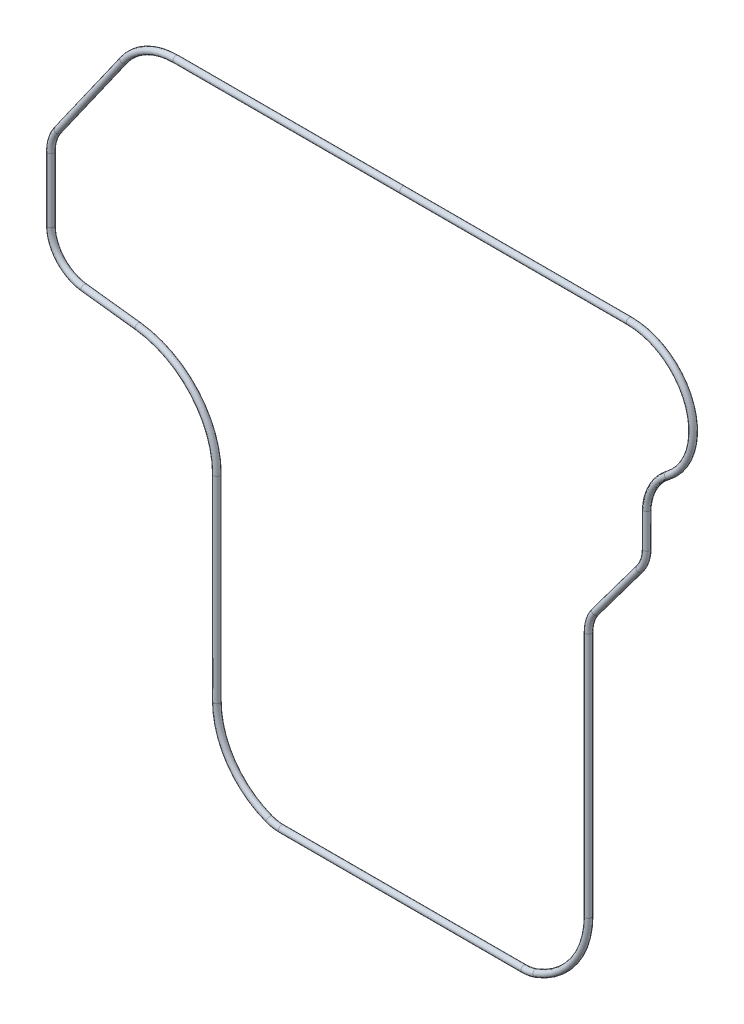
ISO-10303-21;
HEADER;
FILE_DESCRIPTION(('STEP AP214'),'2;1');
FILE_NAME('part.step','',(''),(''),'','','');
FILE_SCHEMA(('AUTOMOTIVE_DESIGN { 1 0 10303 214 1 1 1 1 }'));
ENDSEC;
DATA;
#1=APPLICATION_CONTEXT('core data for automotive mechanical design processes');
#2=APPLICATION_PROTOCOL_DEFINITION('international standard','automotive_design',2000,#1);
#3=PRODUCT_CONTEXT('',#1,'mechanical');
#4=PRODUCT('Part','Part','',(#3));
#5=PRODUCT_RELATED_PRODUCT_CATEGORY('part','',(#4));
#6=PRODUCT_DEFINITION_FORMATION('','',#4);
#7=PRODUCT_DEFINITION_CONTEXT('part definition',#1,'design');
#8=PRODUCT_DEFINITION('design','',#6,#7);
#9=PRODUCT_DEFINITION_SHAPE('','',#8);
#10=(LENGTH_UNIT() NAMED_UNIT(*) SI_UNIT(.MILLI.,.METRE.));
#11=(NAMED_UNIT(*) PLANE_ANGLE_UNIT() SI_UNIT($,.RADIAN.));
#12=(NAMED_UNIT(*) SI_UNIT($,.STERADIAN.) SOLID_ANGLE_UNIT());
#13=UNCERTAINTY_MEASURE_WITH_UNIT(LENGTH_MEASURE(1.E-05),#10,'distance_accuracy_value','');
#14=(GEOMETRIC_REPRESENTATION_CONTEXT(3) GLOBAL_UNCERTAINTY_ASSIGNED_CONTEXT((#13)) GLOBAL_UNIT_ASSIGNED_CONTEXT((#10,
#11,#12)) REPRESENTATION_CONTEXT('',''));
#15=CARTESIAN_POINT('',(0.,0.,0.));
#16=DIRECTION('',(0.,0.,1.));
#17=DIRECTION('',(1.,0.,0.));
#18=AXIS2_PLACEMENT_3D('',#15,#16,#17);
#19=CARTESIAN_POINT('',(79.1999999999994,22.1178470088791,0.));
#20=DIRECTION('',(0.,-1.,0.));
#21=DIRECTION('',(0.,0.,-1.));
#22=AXIS2_PLACEMENT_3D('',#19,#20,#21);
#23=CYLINDRICAL_SURFACE('',#22,1.);
#24=CARTESIAN_POINT('',(79.1999999999994,10.7627263465945,0.));
#25=DIRECTION('',(0.,-1.,0.));
#26=DIRECTION('',(0.,0.,-1.));
#27=AXIS2_PLACEMENT_3D('',#24,#25,#26);
#28=CIRCLE('',#27,1.);
#29=CARTESIAN_POINT('',(80.1999999999994,10.7627263465945,0.));
#30=VERTEX_POINT('',#29);
#31=EDGE_CURVE('E65',#30,#30,#28,.T.);
#32=ORIENTED_EDGE('',*,*,#31,.F.);
#33=EDGE_LOOP('',(#32));
#34=FACE_BOUND('',#33,.T.);
#35=CARTESIAN_POINT('',(79.1999999999994,21.9178469553514,-1.));
#36=CARTESIAN_POINT('',(79.2082017376252,21.9175761443631,-1.00000073367701));
#37=CARTESIAN_POINT('',(79.21640651697,21.9173051374655,-0.999899657464425));
#38=CARTESIAN_POINT('',(79.2807267477004,21.9151798774864,-0.998311706241539));
#39=CARTESIAN_POINT('',(79.3368391829476,21.9133214089332,-0.992179149295365));
#40=CARTESIAN_POINT('',(79.419595467947,21.910574294768,-0.97599987714884));
#41=CARTESIAN_POINT('',(79.4469857828581,21.9096640113042,-0.96942815672692));
#42=CARTESIAN_POINT('',(79.5011422469306,21.9078622202176,-0.953994745867448));
#43=CARTESIAN_POINT('',(79.5279078846614,21.9069707280335,-0.945131246201956));
#44=CARTESIAN_POINT('',(79.6068389505055,21.9043389545516,-0.915225879192634));
#45=CARTESIAN_POINT('',(79.6577817944123,21.9026366188866,-0.890840980597625));
#46=CARTESIAN_POINT('',(79.7548274089324,21.8993876348943,-0.83386844467549));
#47=CARTESIAN_POINT('',(79.8009299839825,21.8978409928577,-0.801280476096961));
#48=CARTESIAN_POINT('',(79.8870019354901,21.8949488545918,-0.728827811671307));
#49=CARTESIAN_POINT('',(79.9269733133405,21.8936032927281,-0.68896549971531));
#50=CARTESIAN_POINT('',(79.9996586084857,21.8911533111379,-0.603085186380973));
#51=CARTESIAN_POINT('',(80.0323716964883,21.8900489189664,-0.557066482569097));
#52=CARTESIAN_POINT('',(80.089588122062,21.8881154363168,-0.460211446323817));
#53=CARTESIAN_POINT('',(80.1140962450528,21.8872861853693,-0.409377944321907));
#54=CARTESIAN_POINT('',(80.154229814811,21.8859274071383,-0.304315080745093));
#55=CARTESIAN_POINT('',(80.1698554449245,21.8853978736682,-0.250085789289292));
#56=CARTESIAN_POINT('',(80.1917740428399,21.8846548972218,-0.139798492897846));
#57=CARTESIAN_POINT('',(80.1980715891562,21.8844412991746,-0.0837413989228813));
#58=CARTESIAN_POINT('',(80.2011690835414,21.8843362524644,0.0286348418982115));
#59=CARTESIAN_POINT('',(80.1979690467777,21.8844448032869,0.0849539883257067));
#60=CARTESIAN_POINT('',(80.1821645666601,21.8849806562676,0.196241447442858));
#61=CARTESIAN_POINT('',(80.1695623774171,21.8854078820252,0.251210080647954));
#62=CARTESIAN_POINT('',(80.135314648384,21.88656793289,0.358251580631631));
#63=CARTESIAN_POINT('',(80.1136689639198,21.8873007628861,0.41032440106908));
#64=CARTESIAN_POINT('',(80.0619458667918,21.8890498265431,0.510105918482551));
#65=CARTESIAN_POINT('',(80.0318668439149,21.8900661143257,0.557813779728821));
#66=CARTESIAN_POINT('',(79.9641354395735,21.8923511817285,0.647498093298433));
#67=CARTESIAN_POINT('',(79.926483846035,21.8936199350795,0.689475141150585));
#68=CARTESIAN_POINT('',(79.8446388398683,21.8963730541399,0.766554593374652));
#69=CARTESIAN_POINT('',(79.8004383208637,21.8978576540356,0.80164943237466));
#70=CARTESIAN_POINT('',(79.7067502116413,21.9009981819638,0.863923608276741));
#71=CARTESIAN_POINT('',(79.6572627895697,21.9026541045474,0.891103196815412));
#72=CARTESIAN_POINT('',(79.5801509812525,21.9052288027018,0.925354683002796));
#73=CARTESIAN_POINT('',(79.5539326436633,21.9061033115538,0.935694284543757));
#74=CARTESIAN_POINT('',(79.500744415389,21.9078754540684,0.954119978233772));
#75=CARTESIAN_POINT('',(79.4737751571675,21.9087730682251,0.962207907256613));
#76=CARTESIAN_POINT('',(79.3920808749926,21.9114889866342,0.982979205884355));
#77=CARTESIAN_POINT('',(79.3364210821881,21.9133353190526,0.99223578642942));
#78=CARTESIAN_POINT('',(79.2618807896286,21.9158021086944,0.998259172014077));
#79=CARTESIAN_POINT('',(79.2432528118138,21.9164180892721,0.999238585857412));
#80=CARTESIAN_POINT('',(79.2164096158097,21.9173050334707,0.999898826290443));
#81=CARTESIAN_POINT('',(79.2082053679793,21.9175760224748,0.999999724928001));
#82=CARTESIAN_POINT('',(79.1999999999994,21.9178469553445,1.));
#83=B_SPLINE_CURVE_WITH_KNOTS('',3,(#35,#36,#37,#38,#39,#40,#41,#42,#43,#44,#45,#46,#47,#48,#49,
#50,#51,#52,#53,#54,#55,#56,#57,#58,#59,#60,#61,#62,#63,#64,#65,#66,#67,#68,#69,#70,#71,#72,#73,
#74,#75,#76,#77,#78,#79,#80,#81,#82),.UNSPECIFIED.,.F.,.F.,(4,2,2,2,2,2,2,2,2,2,2,2,2,2,2,2,2,2,
2,2,2,2,2,4),(0.,0.0246265151168549,0.193057703047495,0.277528753899155,0.36206669448003,
0.530709949008408,0.69936001467928,0.867954910594419,1.03656905932457,1.2050846944223,
1.37359685101487,1.54202626914943,1.71045541830749,1.87884420053672,2.04723567668411,
2.21565932645445,2.38406546080426,2.55265569300436,2.72124056490601,2.80574272531512,
2.89017574702905,3.05856086194076,3.11453486308086,3.1391613781986),.UNSPECIFIED.);
#84=CARTESIAN_POINT('',(79.1999999999994,21.9178469553514,-1.));
#85=VERTEX_POINT('',#84);
#86=CARTESIAN_POINT('',(79.1999999999994,21.9178469553445,1.));
#87=VERTEX_POINT('',#86);
#88=EDGE_CURVE('E59',#85,#87,#83,.T.);
#89=ORIENTED_EDGE('',*,*,#88,.T.);
#90=CARTESIAN_POINT('',(79.1999999999994,21.9178469553514,-1.));
#91=CARTESIAN_POINT('',(79.1917982625029,21.9181177679553,-1.00000073369725));
#92=CARTESIAN_POINT('',(79.1835934800225,21.9183886806649,-0.999899657478619));
#93=CARTESIAN_POINT('',(79.1192743354303,21.9205124232765,-0.998311732382476));
#94=CARTESIAN_POINT('',(79.0631628452419,21.9223651387331,-0.99217938282574));
#95=CARTESIAN_POINT('',(78.9804077285927,21.9250975589645,-0.976000584189315));
#96=CARTESIAN_POINT('',(78.9530177643057,21.9260019201098,-0.969429049978711));
#97=CARTESIAN_POINT('',(78.8988619247357,21.9277900278391,-0.953996052275597));
#98=CARTESIAN_POINT('',(78.8720965608314,21.9286737575317,-0.945132779555896));
#99=CARTESIAN_POINT('',(78.7931661741226,21.9312798425419,-0.915228121236713));
#100=CARTESIAN_POINT('',(78.7422236342751,21.9329618227085,-0.890843740887001));
#101=CARTESIAN_POINT('',(78.6451784494582,21.9361659587721,-0.833872311192619));
#102=CARTESIAN_POINT('',(78.5990759999959,21.937688108213,-0.801284930682488));
#103=CARTESIAN_POINT('',(78.513004595697,21.9405298814135,-0.728833891357575));
#104=CARTESIAN_POINT('',(78.4730335819171,21.9418495731586,-0.688972684990557));
#105=CARTESIAN_POINT('',(78.4003487579823,21.9442493390943,-0.603094851965929));
#106=CARTESIAN_POINT('',(78.3676357775037,21.9453293858907,-0.55707752255567));
#107=CARTESIAN_POINT('',(78.3104188407794,21.947218444605,-0.46022484333734));
#108=CARTESIAN_POINT('',(78.2859102087411,21.9480276109022,-0.40939225908939));
#109=CARTESIAN_POINT('',(78.2457754049871,21.9493526809993,-0.304331324697194));
#110=CARTESIAN_POINT('',(78.2301490514494,21.9498685908022,-0.25010304408875));
#111=CARTESIAN_POINT('',(78.2082284110909,21.9505923081293,-0.139816205522922));
#112=CARTESIAN_POINT('',(78.2019298071171,21.9508002581862,-0.0837585065595365));
#113=CARTESIAN_POINT('',(78.1988304260568,21.9509025851099,0.0286190946522837));
#114=CARTESIAN_POINT('',(78.2020296349412,21.9507969624399,0.0849389965133016));
#115=CARTESIAN_POINT('',(78.2178328639477,21.9502752139775,0.196229061492773));
#116=CARTESIAN_POINT('',(78.2304347837723,21.9498591575271,0.251199523205774));
#117=CARTESIAN_POINT('',(78.264682619956,21.9487284505549,0.358244727258841));
#118=CARTESIAN_POINT('',(78.2863286807049,21.948013795266,0.410319423352979));
#119=CARTESIAN_POINT('',(78.3380529429223,21.9463060857482,0.510104056177596));
#120=CARTESIAN_POINT('',(78.3681326655756,21.9453129812954,0.557813203430318));
#121=CARTESIAN_POINT('',(78.435865975413,21.943076702711,0.647499893736665));
#122=CARTESIAN_POINT('',(78.4735187729453,21.9418335546517,0.689478033602478));
#123=CARTESIAN_POINT('',(78.5553646974771,21.9391313036436,0.766557498062543));
#124=CARTESIAN_POINT('',(78.5995646298744,21.9376719759875,0.80165157774803));
#125=CARTESIAN_POINT('',(78.6932513566973,21.9345787418933,0.863924466949394));
#126=CARTESIAN_POINT('',(78.7427379824521,21.9329448410248,0.891103528889139));
#127=CARTESIAN_POINT('',(78.8198483950072,21.9303988619706,0.925354411397195));
#128=CARTESIAN_POINT('',(78.8460662289306,21.9295332156736,0.935693841603948));
#129=CARTESIAN_POINT('',(78.899253381541,21.927777102772,0.954119267414231));
#130=CARTESIAN_POINT('',(78.9262220678307,21.9268866570544,0.962207099802287));
#131=CARTESIAN_POINT('',(79.0079145369177,21.9241893410113,0.982978241675913));
#132=CARTESIAN_POINT('',(79.0635729738537,21.9223515971893,0.992234887404051));
#133=CARTESIAN_POINT('',(79.1381142695544,21.919890348679,0.998258912603054));
#134=CARTESIAN_POINT('',(79.1567447194463,21.9192751953508,0.999238524942661));
#135=CARTESIAN_POINT('',(79.1835903812109,21.9183887830659,0.999898826301882));
#136=CARTESIAN_POINT('',(79.191794632218,21.918117887871,0.99999972495621));
#137=CARTESIAN_POINT('',(79.1999999999994,21.9178469553445,1.));
#138=B_SPLINE_CURVE_WITH_KNOTS('',3,(#90,#91,#92,#93,#94,#95,#96,#97,#98,#99,#100,#101,#102,
#103,#104,#105,#106,#107,#108,#109,#110,#111,#112,#113,#114,#115,#116,#117,#118,#119,#120,#121,
#122,#123,#124,#125,#126,#127,#128,#129,#130,#131,#132,#133,#134,#135,#136,#137),.UNSPECIFIED.,
.F.,.F.,(4,2,2,2,2,2,2,2,2,2,2,2,2,2,2,2,2,2,2,2,2,2,2,4),(0.,0.0246265151180311,
0.193054295158904,0.277523621772505,0.36205983791306,0.530699770650304,0.699346512686504,
0.867936498388739,1.03654574594097,1.20505873606634,1.37356827657328,1.54199980157853,
1.71043107779737,1.87882474252892,2.04722109576738,2.21564784232279,2.38405703595472,
2.55264252660061,2.72122264016911,2.80572239023953,2.89015300465176,3.05853336675277,
3.11451470966584,3.13914122478459),.UNSPECIFIED.);
#139=EDGE_CURVE('E57',#85,#87,#138,.T.);
#140=ORIENTED_EDGE('',*,*,#139,.F.);
#141=EDGE_LOOP('',(#89,#140));
#142=FACE_BOUND('',#141,.T.);
#143=ADVANCED_FACE('F43',(#34,#142),#23,.T.);
#144=CARTESIAN_POINT('',(67.8999999999997,10.7627263465945,0.));
#145=DIRECTION('',(0.,0.,-1.));
#146=DIRECTION('',(-1.,0.,0.));
#147=AXIS2_PLACEMENT_3D('',#144,#145,#146);
#148=TOROIDAL_SURFACE('',#147,11.2999999999997,1.);
#149=CARTESIAN_POINT('',(76.953598770054,4.0008960240513,0.));
#150=DIRECTION('',(-0.598392063941891,-0.801203430978278,0.));
#151=DIRECTION('',(0.,0.,-1.));
#152=AXIS2_PLACEMENT_3D('',#149,#150,#151);
#153=CIRCLE('',#152,1.);
#154=CARTESIAN_POINT('',(77.7548022010323,3.40250396010941,0.));
#155=VERTEX_POINT('',#154);
#156=EDGE_CURVE('E68',#155,#155,#153,.T.);
#157=CARTESIAN_POINT('',(67.8999999999997,10.7627263465945,0.));
#158=DIRECTION('',(0.,0.,-1.));
#159=DIRECTION('',(-1.,0.,0.));
#160=AXIS2_PLACEMENT_3D('',#157,#158,#159);
#161=CIRCLE('',#160,12.2999999999997);
#162=EDGE_CURVE('',#30,#155,#161,.T.);
#163=ORIENTED_EDGE('',*,*,#31,.T.);
#164=ORIENTED_EDGE('',*,*,#156,.F.);
#165=ORIENTED_EDGE('',*,*,#162,.T.);
#166=ORIENTED_EDGE('',*,*,#162,.F.);
#167=EDGE_LOOP('',(#163,#165,#164,#166));
#168=FACE_BOUND('',#167,.T.);
#169=ADVANCED_FACE('F91',(#168),#148,.T.);
#170=CARTESIAN_POINT('',(76.953598770054,4.0008960240513,0.));
#171=DIRECTION('',(-0.598392063941919,-0.801203430978257,0.));
#172=DIRECTION('',(0.801203430978257,-0.598392063941919,0.));
#173=AXIS2_PLACEMENT_3D('',#170,#171,#172);
#174=CYLINDRICAL_SURFACE('',#173,1.);
#175=CARTESIAN_POINT('',(62.5845836256946,-15.2381696774563,0.));
#176=DIRECTION('',(-0.598392063941919,-0.801203430978257,0.));
#177=DIRECTION('',(0.,0.,-1.));
#178=AXIS2_PLACEMENT_3D('',#175,#176,#177);
#179=CIRCLE('',#178,1.);
#180=CARTESIAN_POINT('',(61.7833801947164,-14.6397776135144,0.));
#181=VERTEX_POINT('',#180);
#182=EDGE_CURVE('E150',#181,#181,#179,.T.);
#183=ORIENTED_EDGE('',*,*,#182,.F.);
#184=EDGE_LOOP('',(#183));
#185=FACE_BOUND('',#184,.T.);
#186=ORIENTED_EDGE('',*,*,#156,.T.);
#187=EDGE_LOOP('',(#186));
#188=FACE_BOUND('',#187,.T.);
#189=ADVANCED_FACE('F95',(#185,#188),#174,.T.);
#190=CARTESIAN_POINT('',(71.6381823957489,-22.,0.));
#191=DIRECTION('',(0.,0.,1.));
#192=DIRECTION('',(1.,0.,0.));
#193=AXIS2_PLACEMENT_3D('',#190,#191,#192);
#194=TOROIDAL_SURFACE('',#193,11.3,1.);
#195=CARTESIAN_POINT('',(60.3381823957489,-22.,0.));
#196=DIRECTION('',(0.,-1.,0.));
#197=DIRECTION('',(0.,0.,-1.));
#198=AXIS2_PLACEMENT_3D('',#195,#196,#197);
#199=CIRCLE('',#198,1.);
#200=CARTESIAN_POINT('',(59.3381823957489,-22.,0.));
#201=VERTEX_POINT('',#200);
#202=EDGE_CURVE('E147',#201,#201,#199,.T.);
#203=CARTESIAN_POINT('',(71.6381823957489,-22.,0.));
#204=DIRECTION('',(0.,0.,1.));
#205=DIRECTION('',(1.,0.,0.));
#206=AXIS2_PLACEMENT_3D('',#203,#204,#205);
#207=CIRCLE('',#206,12.3);
#208=EDGE_CURVE('',#181,#201,#207,.T.);
#209=ORIENTED_EDGE('',*,*,#182,.T.);
#210=ORIENTED_EDGE('',*,*,#202,.F.);
#211=ORIENTED_EDGE('',*,*,#208,.T.);
#212=ORIENTED_EDGE('',*,*,#208,.F.);
#213=EDGE_LOOP('',(#209,#211,#210,#212));
#214=FACE_BOUND('',#213,.T.);
#215=ADVANCED_FACE('F99',(#214),#194,.T.);
#216=CARTESIAN_POINT('',(60.3381823957489,-22.,0.));
#217=DIRECTION('',(0.,-1.,0.));
#218=DIRECTION('',(0.,0.,-1.));
#219=AXIS2_PLACEMENT_3D('',#216,#217,#218);
#220=CYLINDRICAL_SURFACE('',#219,1.);
#221=CARTESIAN_POINT('',(60.3381823957489,-101.879976255137,0.));
#222=DIRECTION('',(0.,-1.,0.));
#223=DIRECTION('',(0.,0.,-1.));
#224=AXIS2_PLACEMENT_3D('',#221,#222,#223);
#225=CIRCLE('',#224,1.);
#226=CARTESIAN_POINT('',(61.3381823957489,-101.879976255137,0.));
#227=VERTEX_POINT('',#226);
#228=EDGE_CURVE('E144',#227,#227,#225,.T.);
#229=ORIENTED_EDGE('',*,*,#228,.F.);
#230=EDGE_LOOP('',(#229));
#231=FACE_BOUND('',#230,.T.);
#232=ORIENTED_EDGE('',*,*,#202,.T.);
#233=EDGE_LOOP('',(#232));
#234=FACE_BOUND('',#233,.T.);
#235=ADVANCED_FACE('F103',(#231,#234),#220,.T.);
#236=CARTESIAN_POINT('',(34.0381823957489,-101.879976255137,0.));
#237=DIRECTION('',(0.,0.,-1.));
#238=DIRECTION('',(-1.,0.,0.));
#239=AXIS2_PLACEMENT_3D('',#236,#237,#238);
#240=TOROIDAL_SURFACE('',#239,26.3,1.);
#241=CARTESIAN_POINT('',(43.3883877154872,-126.46175122113,0.));
#242=DIRECTION('',(-0.934668249657543,-0.355521114818945,0.));
#243=DIRECTION('',(0.,0.,-1.));
#244=AXIS2_PLACEMENT_3D('',#241,#242,#243);
#245=CIRCLE('',#244,1.);
#246=CARTESIAN_POINT('',(43.7439088303061,-127.396419470788,0.));
#247=VERTEX_POINT('',#246);
#248=EDGE_CURVE('E141',#247,#247,#245,.T.);
#249=CARTESIAN_POINT('',(34.0381823957489,-101.879976255137,0.));
#250=DIRECTION('',(0.,0.,-1.));
#251=DIRECTION('',(-1.,0.,0.));
#252=AXIS2_PLACEMENT_3D('',#249,#250,#251);
#253=CIRCLE('',#252,27.3);
#254=EDGE_CURVE('',#227,#247,#253,.T.);
#255=ORIENTED_EDGE('',*,*,#228,.T.);
#256=ORIENTED_EDGE('',*,*,#248,.F.);
#257=ORIENTED_EDGE('',*,*,#254,.T.);
#258=ORIENTED_EDGE('',*,*,#254,.F.);
#259=EDGE_LOOP('',(#255,#257,#256,#258));
#260=FACE_BOUND('',#259,.T.);
#261=ADVANCED_FACE('F107',(#260),#240,.T.);
#262=CARTESIAN_POINT('',(39.3709991180331,-115.9,0.));
#263=DIRECTION('',(0.,0.,-1.));
#264=DIRECTION('',(-1.,0.,0.));
#265=AXIS2_PLACEMENT_3D('',#262,#263,#264);
#266=TOROIDAL_SURFACE('',#265,11.3,1.);
#267=CARTESIAN_POINT('',(39.3709991180331,-127.2,0.));
#268=DIRECTION('',(-1.,0.,0.));
#269=DIRECTION('',(0.,0.,-1.));
#270=AXIS2_PLACEMENT_3D('',#267,#268,#269);
#271=CIRCLE('',#270,1.);
#272=CARTESIAN_POINT('',(39.3709991180331,-128.2,0.));
#273=VERTEX_POINT('',#272);
#274=EDGE_CURVE('E136',#273,#273,#271,.T.);
#275=CARTESIAN_POINT('',(39.3709991180331,-115.9,0.));
#276=DIRECTION('',(0.,0.,-1.));
#277=DIRECTION('',(-1.,0.,0.));
#278=AXIS2_PLACEMENT_3D('',#275,#276,#277);
#279=CIRCLE('',#278,12.3);
#280=EDGE_CURVE('',#247,#273,#279,.T.);
#281=ORIENTED_EDGE('',*,*,#248,.T.);
#282=ORIENTED_EDGE('',*,*,#274,.F.);
#283=ORIENTED_EDGE('',*,*,#280,.T.);
#284=ORIENTED_EDGE('',*,*,#280,.F.);
#285=EDGE_LOOP('',(#281,#283,#282,#284));
#286=FACE_BOUND('',#285,.T.);
#287=ADVANCED_FACE('F111',(#286),#266,.T.);
#288=CARTESIAN_POINT('',(39.3709991180331,-127.2,0.));
#289=DIRECTION('',(-1.,0.,0.));
#290=DIRECTION('',(0.,0.,1.));
#291=AXIS2_PLACEMENT_3D('',#288,#289,#290);
#292=CYLINDRICAL_SURFACE('',#291,1.);
#293=CARTESIAN_POINT('',(-39.3709991180337,-127.2,0.));
#294=DIRECTION('',(-1.,0.,0.));
#295=DIRECTION('',(0.,0.,-1.));
#296=AXIS2_PLACEMENT_3D('',#293,#294,#295);
#297=CIRCLE('',#296,1.);
#298=CARTESIAN_POINT('',(-39.3709991180337,-128.2,0.));
#299=VERTEX_POINT('',#298);
#300=EDGE_CURVE('E134',#299,#299,#297,.T.);
#301=ORIENTED_EDGE('',*,*,#300,.F.);
#302=EDGE_LOOP('',(#301));
#303=FACE_BOUND('',#302,.T.);
#304=ORIENTED_EDGE('',*,*,#274,.T.);
#305=EDGE_LOOP('',(#304));
#306=FACE_BOUND('',#305,.T.);
#307=ADVANCED_FACE('F115',(#303,#306),#292,.T.);
#308=CARTESIAN_POINT('',(-39.3709991180337,-115.9,0.));
#309=DIRECTION('',(0.,0.,-1.));
#310=DIRECTION('',(-1.,0.,0.));
#311=AXIS2_PLACEMENT_3D('',#308,#309,#310);
#312=TOROIDAL_SURFACE('',#311,11.3,1.);
#313=CARTESIAN_POINT('',(-43.3883877154878,-126.46175122113,0.));
#314=DIRECTION('',(-0.934668249657541,0.355521114818949,0.));
#315=DIRECTION('',(0.,0.,-1.));
#316=AXIS2_PLACEMENT_3D('',#313,#314,#315);
#317=CIRCLE('',#316,1.);
#318=CARTESIAN_POINT('',(-43.7439088303067,-127.396419470788,0.));
#319=VERTEX_POINT('',#318);
#320=EDGE_CURVE('E51',#319,#319,#317,.T.);
#321=CARTESIAN_POINT('',(-39.3709991180337,-115.9,0.));
#322=DIRECTION('',(0.,0.,-1.));
#323=DIRECTION('',(-1.,0.,0.));
#324=AXIS2_PLACEMENT_3D('',#321,#322,#323);
#325=CIRCLE('',#324,12.3);
#326=EDGE_CURVE('',#299,#319,#325,.T.);
#327=ORIENTED_EDGE('',*,*,#300,.T.);
#328=ORIENTED_EDGE('',*,*,#320,.F.);
#329=ORIENTED_EDGE('',*,*,#326,.T.);
#330=ORIENTED_EDGE('',*,*,#326,.F.);
#331=EDGE_LOOP('',(#327,#329,#328,#330));
#332=FACE_BOUND('',#331,.T.);
#333=ADVANCED_FACE('F119',(#332),#312,.T.);
#334=CARTESIAN_POINT('',(-34.0381823957495,-101.879976255137,0.));
#335=DIRECTION('',(0.,0.,-1.));
#336=DIRECTION('',(-1.,0.,0.));
#337=AXIS2_PLACEMENT_3D('',#334,#335,#336);
#338=TOROIDAL_SURFACE('',#337,26.3,1.);
#339=CARTESIAN_POINT('',(-60.3381823957495,-101.879976255137,0.));
#340=DIRECTION('',(0.,1.,0.));
#341=DIRECTION('',(0.,0.,-1.));
#342=AXIS2_PLACEMENT_3D('',#339,#340,#341);
#343=CIRCLE('',#342,1.);
#344=CARTESIAN_POINT('',(-61.3381823957495,-101.879976255137,0.));
#345=VERTEX_POINT('',#344);
#346=EDGE_CURVE('E11',#345,#345,#343,.T.);
#347=CARTESIAN_POINT('',(-34.0381823957495,-101.879976255137,0.));
#348=DIRECTION('',(0.,0.,-1.));
#349=DIRECTION('',(-1.,0.,0.));
#350=AXIS2_PLACEMENT_3D('',#347,#348,#349);
#351=CIRCLE('',#350,27.3);
#352=EDGE_CURVE('',#319,#345,#351,.T.);
#353=ORIENTED_EDGE('',*,*,#320,.T.);
#354=ORIENTED_EDGE('',*,*,#346,.F.);
#355=ORIENTED_EDGE('',*,*,#352,.T.);
#356=ORIENTED_EDGE('',*,*,#352,.F.);
#357=EDGE_LOOP('',(#353,#355,#354,#356));
#358=FACE_BOUND('',#357,.T.);
#359=ADVANCED_FACE('F122',(#358),#338,.T.);
#360=CARTESIAN_POINT('',(-60.3381823957495,-101.879976255137,0.));
#361=DIRECTION('',(0.,1.,0.));
#362=DIRECTION('',(0.,0.,1.));
#363=AXIS2_PLACEMENT_3D('',#360,#361,#362);
#364=CYLINDRICAL_SURFACE('',#363,1.);
#365=ORIENTED_EDGE('',*,*,#346,.T.);
#366=EDGE_LOOP('',(#365));
#367=FACE_BOUND('',#366,.T.);
#368=CARTESIAN_POINT('',(-60.3381823957495,-38.,0.));
#369=DIRECTION('',(0.,1.,0.));
#370=DIRECTION('',(0.,0.,-1.));
#371=AXIS2_PLACEMENT_3D('',#368,#369,#370);
#372=CIRCLE('',#371,1.);
#373=CARTESIAN_POINT('',(-59.3381823957495,-38.,0.));
#374=VERTEX_POINT('',#373);
#375=EDGE_CURVE('E63',#374,#374,#372,.T.);
#376=ORIENTED_EDGE('',*,*,#375,.F.);
#377=EDGE_LOOP('',(#376));
#378=FACE_BOUND('',#377,.T.);
#379=ADVANCED_FACE('F45',(#367,#378),#364,.T.);
#380=CARTESIAN_POINT('',(86.1575741511881,34.8902999633782,-1.));
#381=CARTESIAN_POINT('',(86.0319390795296,34.794351937622,-1.));
#382=CARTESIAN_POINT('',(85.9075864475267,34.6967333998054,-1.));
#383=CARTESIAN_POINT('',(85.6615286092274,34.4982207713294,-1.));
#384=CARTESIAN_POINT('',(85.5398234105617,34.39732668864,-1.));
#385=CARTESIAN_POINT('',(85.1788030429155,34.0898342086015,-1.));
#386=CARTESIAN_POINT('',(84.943583480416,33.8784240139631,-1.));
#387=CARTESIAN_POINT('',(84.2552926480617,33.2258296162179,-1.));
#388=CARTESIAN_POINT('',(83.8196051057112,32.7662609578983,-1.));
#389=CARTESIAN_POINT('',(82.5895735828997,31.3219257731726,-1.));
#390=CARTESIAN_POINT('',(81.8726906869978,30.2714854026847,-1.));
#391=CARTESIAN_POINT('',(80.6772148695668,28.0425111227842,-1.));
#392=CARTESIAN_POINT('',(80.1988003243241,26.8643432975774,-1.));
#393=CARTESIAN_POINT('',(79.6760872214833,25.0407773514837,-1.));
#394=CARTESIAN_POINT('',(79.5342677093764,24.423617010861,-1.));
#395=CARTESIAN_POINT('',(79.3713789950309,23.489180287576,-1.));
#396=CARTESIAN_POINT('',(79.3253832353534,23.1762524454749,-1.));
#397=CARTESIAN_POINT('',(79.2501223247544,22.5483637359534,-1.));
#398=CARTESIAN_POINT('',(79.2208613874021,22.2334029448921,-1.));
#399=CARTESIAN_POINT('',(79.195602274235,21.8513255549026,-1.));
#400=CARTESIAN_POINT('',(79.1912064129218,21.7848039684581,-1.));
#401=CARTESIAN_POINT('',(79.1868096176217,21.7182824483661,-1.));
#402=CARTESIAN_POINT('',(87.3714694159217,33.300816309402,-1.));
#403=CARTESIAN_POINT('',(87.2468231711446,33.20562345484,-1.));
#404=CARTESIAN_POINT('',(87.1495702331492,33.1289988109964,-1.));
#405=CARTESIAN_POINT('',(86.9311593583424,32.9527909846363,-1.));
#406=CARTESIAN_POINT('',(86.8231289087018,32.8632333220348,-1.));
#407=CARTESIAN_POINT('',(86.5026726498594,32.5902905780606,-1.));
#408=CARTESIAN_POINT('',(86.293882266379,32.402634351081,-1.));
#409=CARTESIAN_POINT('',(85.6829275255922,31.8233652073311,-1.));
#410=CARTESIAN_POINT('',(85.2961936669041,31.4154335056171,-1.));
#411=CARTESIAN_POINT('',(84.20436801,30.1333832633245,-1.));
#412=CARTESIAN_POINT('',(83.5680337988685,29.2009699663719,-1.));
#413=CARTESIAN_POINT('',(82.5068811816642,27.2224423740009,-1.));
#414=CARTESIAN_POINT('',(82.0822211095901,26.1766530297131,-1.));
#415=CARTESIAN_POINT('',(81.6182398487082,24.5579822476486,-1.));
#416=CARTESIAN_POINT('',(81.4923551220987,24.0101658040723,-1.));
#417=CARTESIAN_POINT('',(81.3477685206663,23.1807220294116,-1.));
#418=CARTESIAN_POINT('',(81.3069408267465,22.902954638554,-1.));
#419=CARTESIAN_POINT('',(81.2401362029371,22.3456152614563,-1.));
#420=CARTESIAN_POINT('',(81.2153347527867,22.0837712321217,-1.));
#421=CARTESIAN_POINT('',(81.1914949930875,21.7231588545644,-1.));
#422=CARTESIAN_POINT('',(81.1868520157226,21.6529001094473,-1.));
#423=CARTESIAN_POINT('',(81.1824552204224,21.5863785893553,-1.));
#424=CARTESIAN_POINT('',(87.3714694159217,33.300816309402,1.));
#425=CARTESIAN_POINT('',(87.2468231711446,33.20562345484,1.));
#426=CARTESIAN_POINT('',(87.1495702331492,33.1289988109964,1.));
#427=CARTESIAN_POINT('',(86.9311593583424,32.9527909846363,1.));
#428=CARTESIAN_POINT('',(86.8231289087018,32.8632333220348,1.));
#429=CARTESIAN_POINT('',(86.5026726498594,32.5902905780606,1.));
#430=CARTESIAN_POINT('',(86.293882266379,32.402634351081,1.));
#431=CARTESIAN_POINT('',(85.6829275255922,31.8233652073311,1.));
#432=CARTESIAN_POINT('',(85.2961936669041,31.4154335056171,1.));
#433=CARTESIAN_POINT('',(84.20436801,30.1333832633245,1.));
#434=CARTESIAN_POINT('',(83.5680337988685,29.2009699663719,1.));
#435=CARTESIAN_POINT('',(82.5068811816642,27.2224423740009,1.));
#436=CARTESIAN_POINT('',(82.0822211095901,26.1766530297131,1.));
#437=CARTESIAN_POINT('',(81.6182398487082,24.5579822476486,1.));
#438=CARTESIAN_POINT('',(81.4923551220987,24.0101658040723,1.));
#439=CARTESIAN_POINT('',(81.3477685206663,23.1807220294116,1.));
#440=CARTESIAN_POINT('',(81.3069408267465,22.902954638554,1.));
#441=CARTESIAN_POINT('',(81.2401362029371,22.3456152614563,1.));
#442=CARTESIAN_POINT('',(81.2153347527867,22.0837712321217,1.));
#443=CARTESIAN_POINT('',(81.1914949930875,21.7231588545644,1.));
#444=CARTESIAN_POINT('',(81.1868520157226,21.6529001094473,1.));
#445=CARTESIAN_POINT('',(81.1824552204224,21.5863785893553,1.));
#446=CARTESIAN_POINT('',(86.1575741511881,34.8902999633782,1.));
#447=CARTESIAN_POINT('',(86.0319390795296,34.794351937622,1.));
#448=CARTESIAN_POINT('',(85.9075864475267,34.6967333998054,1.));
#449=CARTESIAN_POINT('',(85.6615286092274,34.4982207713294,1.));
#450=CARTESIAN_POINT('',(85.5398234105617,34.39732668864,1.));
#451=CARTESIAN_POINT('',(85.1788030429155,34.0898342086015,1.));
#452=CARTESIAN_POINT('',(84.943583480416,33.8784240139631,1.));
#453=CARTESIAN_POINT('',(84.2552926480617,33.2258296162179,1.));
#454=CARTESIAN_POINT('',(83.8196051057112,32.7662609578983,1.));
#455=CARTESIAN_POINT('',(82.5895735828997,31.3219257731726,1.));
#456=CARTESIAN_POINT('',(81.8726906869978,30.2714854026847,1.));
#457=CARTESIAN_POINT('',(80.6772148695668,28.0425111227842,1.));
#458=CARTESIAN_POINT('',(80.1988003243241,26.8643432975774,1.));
#459=CARTESIAN_POINT('',(79.6760872214833,25.0407773514837,1.));
#460=CARTESIAN_POINT('',(79.5342677093764,24.423617010861,1.));
#461=CARTESIAN_POINT('',(79.3713789950309,23.489180287576,1.));
#462=CARTESIAN_POINT('',(79.3253832353534,23.1762524454749,1.));
#463=CARTESIAN_POINT('',(79.2501223247544,22.5483637359534,1.));
#464=CARTESIAN_POINT('',(79.2208613874021,22.2334029448921,1.));
#465=CARTESIAN_POINT('',(79.195602274235,21.8513255549026,1.));
#466=CARTESIAN_POINT('',(79.1912064129218,21.7848039684581,1.));
#467=CARTESIAN_POINT('',(79.1868096176217,21.7182824483661,1.));
#468=CARTESIAN_POINT('',(84.9436788864546,36.4797836173543,1.));
#469=CARTESIAN_POINT('',(84.8170549879145,36.383080420404,1.));
#470=CARTESIAN_POINT('',(84.6656026619042,36.2644679886145,1.));
#471=CARTESIAN_POINT('',(84.3918978601125,36.0436505580224,1.));
#472=CARTESIAN_POINT('',(84.2565179124216,35.9314200552453,1.));
#473=CARTESIAN_POINT('',(83.8549334359716,35.5893778391424,1.));
#474=CARTESIAN_POINT('',(83.5932846944531,35.3542136768453,1.));
#475=CARTESIAN_POINT('',(82.8276577705311,34.6282940251047,1.));
#476=CARTESIAN_POINT('',(82.3430165445183,34.1170884101794,1.));
#477=CARTESIAN_POINT('',(80.9747791557994,32.5104682830207,1.));
#478=CARTESIAN_POINT('',(80.177347575127,31.3420008389975,1.));
#479=CARTESIAN_POINT('',(78.8475485574693,28.8625798715675,1.));
#480=CARTESIAN_POINT('',(78.315379539058,27.5520335654416,1.));
#481=CARTESIAN_POINT('',(77.7339345942583,25.5235724553188,1.));
#482=CARTESIAN_POINT('',(77.576180296654,24.8370682176497,1.));
#483=CARTESIAN_POINT('',(77.3949894693956,23.7976385457404,1.));
#484=CARTESIAN_POINT('',(77.3438256439602,23.4495502523957,1.));
#485=CARTESIAN_POINT('',(77.2601084465718,22.7511122104504,1.));
#486=CARTESIAN_POINT('',(77.2263880220175,22.3830346576626,1.));
#487=CARTESIAN_POINT('',(77.1997095553825,21.9794922552408,1.));
#488=CARTESIAN_POINT('',(77.1955608101211,21.916707827469,1.));
#489=CARTESIAN_POINT('',(77.1911640148209,21.850186307377,1.));
#490=CARTESIAN_POINT('',(84.9436788864546,36.4797836173543,-1.));
#491=CARTESIAN_POINT('',(84.8170549879145,36.383080420404,-1.));
#492=CARTESIAN_POINT('',(84.6656026619042,36.2644679886145,-1.));
#493=CARTESIAN_POINT('',(84.3918978601125,36.0436505580224,-1.));
#494=CARTESIAN_POINT('',(84.2565179124216,35.9314200552453,-1.));
#495=CARTESIAN_POINT('',(83.8549334359716,35.5893778391424,-1.));
#496=CARTESIAN_POINT('',(83.5932846944531,35.3542136768453,-1.));
#497=CARTESIAN_POINT('',(82.8276577705311,34.6282940251047,-1.));
#498=CARTESIAN_POINT('',(82.3430165445183,34.1170884101794,-1.));
#499=CARTESIAN_POINT('',(80.9747791557994,32.5104682830207,-1.));
#500=CARTESIAN_POINT('',(80.177347575127,31.3420008389975,-1.));
#501=CARTESIAN_POINT('',(78.8475485574693,28.8625798715675,-1.));
#502=CARTESIAN_POINT('',(78.315379539058,27.5520335654416,-1.));
#503=CARTESIAN_POINT('',(77.7339345942583,25.5235724553188,-1.));
#504=CARTESIAN_POINT('',(77.576180296654,24.8370682176497,-1.));
#505=CARTESIAN_POINT('',(77.3949894693956,23.7976385457404,-1.));
#506=CARTESIAN_POINT('',(77.3438256439602,23.4495502523957,-1.));
#507=CARTESIAN_POINT('',(77.2601084465718,22.7511122104504,-1.));
#508=CARTESIAN_POINT('',(77.2263880220175,22.3830346576626,-1.));
#509=CARTESIAN_POINT('',(77.1997095553825,21.9794922552408,-1.));
#510=CARTESIAN_POINT('',(77.1955608101211,21.916707827469,-1.));
#511=CARTESIAN_POINT('',(77.1911640148209,21.850186307377,-1.));
#512=CARTESIAN_POINT('',(86.1575741511881,34.8902999633782,-1.));
#513=CARTESIAN_POINT('',(86.0319390795296,34.794351937622,-1.));
#514=CARTESIAN_POINT('',(85.9075864475267,34.6967333998054,-1.));
#515=CARTESIAN_POINT('',(85.6615286092274,34.4982207713294,-1.));
#516=CARTESIAN_POINT('',(85.5398234105617,34.39732668864,-1.));
#517=CARTESIAN_POINT('',(85.1788030429155,34.0898342086015,-1.));
#518=CARTESIAN_POINT('',(84.943583480416,33.8784240139631,-1.));
#519=CARTESIAN_POINT('',(84.2552926480617,33.2258296162179,-1.));
#520=CARTESIAN_POINT('',(83.8196051057112,32.7662609578983,-1.));
#521=CARTESIAN_POINT('',(82.5895735828997,31.3219257731726,-1.));
#522=CARTESIAN_POINT('',(81.8726906869978,30.2714854026847,-1.));
#523=CARTESIAN_POINT('',(80.6772148695668,28.0425111227842,-1.));
#524=CARTESIAN_POINT('',(80.1988003243241,26.8643432975774,-1.));
#525=CARTESIAN_POINT('',(79.6760872214833,25.0407773514837,-1.));
#526=CARTESIAN_POINT('',(79.5342677093764,24.423617010861,-1.));
#527=CARTESIAN_POINT('',(79.3713789950309,23.489180287576,-1.));
#528=CARTESIAN_POINT('',(79.3253832353534,23.1762524454749,-1.));
#529=CARTESIAN_POINT('',(79.2501223247544,22.5483637359534,-1.));
#530=CARTESIAN_POINT('',(79.2208613874021,22.2334029448921,-1.));
#531=CARTESIAN_POINT('',(79.195602274235,21.8513255549026,-1.));
#532=CARTESIAN_POINT('',(79.1912064129218,21.7848039684581,-1.));
#533=CARTESIAN_POINT('',(79.1868096176217,21.7182824483661,-1.));
#534=(BOUNDED_SURFACE() B_SPLINE_SURFACE(3,3,((#380,#381,#382,#383,#384,#385,#386,#387,#388,
#389,#390,#391,#392,#393,#394,#395,#396,#397,#398,#399,#400,#401),(#402,#403,#404,#405,#406,
#407,#408,#409,#410,#411,#412,#413,#414,#415,#416,#417,#418,#419,#420,#421,#422,#423),(#424,
#425,#426,#427,#428,#429,#430,#431,#432,#433,#434,#435,#436,#437,#438,#439,#440,#441,#442,#443,
#444,#445),(#446,#447,#448,#449,#450,#451,#452,#453,#454,#455,#456,#457,#458,#459,#460,#461,
#462,#463,#464,#465,#466,#467),(#468,#469,#470,#471,#472,#473,#474,#475,#476,#477,#478,#479,
#480,#481,#482,#483,#484,#485,#486,#487,#488,#489),(#490,#491,#492,#493,#494,#495,#496,#497,
#498,#499,#500,#501,#502,#503,#504,#505,#506,#507,#508,#509,#510,#511),(#512,#513,#514,#515,
#516,#517,#518,#519,#520,#521,#522,#523,#524,#525,#526,#527,#528,#529,#530,#531,#532,#533)),
.UNSPECIFIED.,.T.,.F.,.F.) B_SPLINE_SURFACE_WITH_KNOTS((4,3,4),(4,2,2,2,2,2,2,2,2,2,4),(0.,0.5,
1.),(0.978941613721235,0.979599688292447,0.980257762863658,0.981573912006081,0.984206210290927,
0.989470806860618,0.994735403430309,0.997367701715154,0.998683850857577,1.,1.00027745367537),
.UNSPECIFIED.) GEOMETRIC_REPRESENTATION_ITEM() RATIONAL_B_SPLINE_SURFACE(((1.,1.,1.,1.,1.,1.,1.,
1.,1.,1.,1.,1.,1.,1.,1.,1.,1.,1.,1.,1.,1.,1.),(0.333333333333333,0.333333333333333,
0.333333333333333,0.333333333333333,0.333333333333333,0.333333333333333,0.333333333333333,
0.333333333333333,0.333333333333333,0.333333333333333,0.333333333333333,0.333333333333333,
0.333333333333333,0.333333333333333,0.333333333333333,0.333333333333333,0.333333333333333,
0.333333333333333,0.333333333333333,0.333333333333333,0.333333333333333,0.333333333333333),
(0.333333333333333,0.333333333333333,0.333333333333333,0.333333333333333,0.333333333333333,
0.333333333333333,0.333333333333333,0.333333333333333,0.333333333333333,0.333333333333333,
0.333333333333333,0.333333333333333,0.333333333333333,0.333333333333333,0.333333333333333,
0.333333333333333,0.333333333333333,0.333333333333333,0.333333333333333,0.333333333333333,
0.333333333333333,0.333333333333333),(1.,1.,1.,1.,1.,1.,1.,1.,1.,1.,1.,1.,1.,1.,1.,1.,1.,1.,1.,
1.,1.,1.),(0.333333333333333,0.333333333333333,0.333333333333333,0.333333333333333,
0.333333333333333,0.333333333333333,0.333333333333333,0.333333333333333,0.333333333333333,
0.333333333333333,0.333333333333333,0.333333333333333,0.333333333333333,0.333333333333333,
0.333333333333333,0.333333333333333,0.333333333333333,0.333333333333333,0.333333333333333,
0.333333333333333,0.333333333333333,0.333333333333333),(0.333333333333333,0.333333333333333,
0.333333333333333,0.333333333333333,0.333333333333333,0.333333333333333,0.333333333333333,
0.333333333333333,0.333333333333333,0.333333333333333,0.333333333333333,0.333333333333333,
0.333333333333333,0.333333333333333,0.333333333333333,0.333333333333333,0.333333333333333,
0.333333333333333,0.333333333333333,0.333333333333333,0.333333333333333,0.333333333333333),(1.,
1.,1.,1.,1.,1.,1.,1.,1.,1.,1.,1.,1.,1.,1.,1.,1.,1.,1.,1.,1.,1.))) REPRESENTATION_ITEM('') SURFACE());
#535=CARTESIAN_POINT('',(86.1575741511881,34.8902999633782,0.));
#536=DIRECTION('',(-0.794741826988083,-0.606947632366784,0.));
#537=DIRECTION('',(0.,0.,-1.));
#538=AXIS2_PLACEMENT_3D('',#535,#536,#537);
#539=CIRCLE('',#538,1.);
#540=CARTESIAN_POINT('',(86.7645217835549,34.0955581363901,0.));
#541=VERTEX_POINT('',#540);
#542=EDGE_CURVE('E203',#541,#541,#539,.T.);
#543=ORIENTED_EDGE('',*,*,#139,.T.);
#544=ORIENTED_EDGE('',*,*,#88,.F.);
#545=EDGE_LOOP('',(#543,#544));
#546=FACE_BOUND('',#545,.T.);
#547=ORIENTED_EDGE('',*,*,#542,.T.);
#548=EDGE_LOOP('',(#547));
#549=FACE_BOUND('',#548,.T.);
#550=ADVANCED_FACE('F60',(#546,#549),#534,.T.);
#551=CARTESIAN_POINT('',(73.5937581657683,51.3414557760441,0.));
#552=DIRECTION('',(0.,0.,-1.));
#553=DIRECTION('',(-1.,0.,0.));
#554=AXIS2_PLACEMENT_3D('',#551,#552,#553);
#555=TOROIDAL_SURFACE('',#554,20.6999999924662,1.);
#556=CARTESIAN_POINT('',(73.5937581657683,72.0414557760449,0.));
#557=DIRECTION('',(1.,0.,0.));
#558=DIRECTION('',(0.,0.,-1.));
#559=AXIS2_PLACEMENT_3D('',#556,#557,#558);
#560=CIRCLE('',#559,1.);
#561=CARTESIAN_POINT('',(73.5937581657683,73.0414557685103,0.));
#562=VERTEX_POINT('',#561);
#563=EDGE_CURVE('E200',#562,#562,#560,.T.);
#564=CARTESIAN_POINT('',(73.5937581657683,51.3414557760441,0.));
#565=DIRECTION('',(0.,0.,-1.));
#566=DIRECTION('',(-1.,0.,0.));
#567=AXIS2_PLACEMENT_3D('',#564,#565,#566);
#568=CIRCLE('',#567,21.6999999924662);
#569=EDGE_CURVE('',#562,#541,#568,.T.);
#570=ORIENTED_EDGE('',*,*,#563,.T.);
#571=ORIENTED_EDGE('',*,*,#542,.F.);
#572=ORIENTED_EDGE('',*,*,#569,.T.);
#573=ORIENTED_EDGE('',*,*,#569,.F.);
#574=EDGE_LOOP('',(#570,#572,#571,#573));
#575=FACE_BOUND('',#574,.T.);
#576=ADVANCED_FACE('F207',(#575),#555,.T.);
#577=CARTESIAN_POINT('',(0.,72.0414557760449,0.));
#578=DIRECTION('',(1.,0.,0.));
#579=DIRECTION('',(0.,0.,-1.));
#580=AXIS2_PLACEMENT_3D('',#577,#578,#579);
#581=CYLINDRICAL_SURFACE('',#580,1.);
#582=ORIENTED_EDGE('',*,*,#563,.F.);
#583=EDGE_LOOP('',(#582));
#584=FACE_BOUND('',#583,.T.);
#585=CARTESIAN_POINT('',(0.,72.0414557760449,0.));
#586=DIRECTION('',(1.,0.,0.));
#587=DIRECTION('',(0.,0.,-1.));
#588=AXIS2_PLACEMENT_3D('',#585,#586,#587);
#589=CIRCLE('',#588,1.);
#590=CARTESIAN_POINT('',(0.,72.0414557760449,-1.));
#591=VERTEX_POINT('',#590);
#592=EDGE_CURVE('E197',#591,#591,#589,.T.);
#593=ORIENTED_EDGE('',*,*,#592,.T.);
#594=EDGE_LOOP('',(#593));
#595=FACE_BOUND('',#594,.T.);
#596=ADVANCED_FACE('F210',(#584,#595),#581,.T.);
#597=CARTESIAN_POINT('',(-73.6305604775861,72.0414557760449,0.));
#598=DIRECTION('',(1.,0.,0.));
#599=DIRECTION('',(0.,0.,-1.));
#600=AXIS2_PLACEMENT_3D('',#597,#598,#599);
#601=CYLINDRICAL_SURFACE('',#600,1.);
#602=ORIENTED_EDGE('',*,*,#592,.F.);
#603=EDGE_LOOP('',(#602));
#604=FACE_BOUND('',#603,.T.);
#605=CARTESIAN_POINT('',(-73.6305604775848,72.0414557760449,0.));
#606=DIRECTION('',(1.,0.,0.));
#607=DIRECTION('',(0.,0.,-1.));
#608=AXIS2_PLACEMENT_3D('',#605,#606,#607);
#609=CIRCLE('',#608,1.);
#610=CARTESIAN_POINT('',(-73.6305604775848,73.0414557760449,0.));
#611=VERTEX_POINT('',#610);
#612=EDGE_CURVE('E194',#611,#611,#609,.T.);
#613=ORIENTED_EDGE('',*,*,#612,.T.);
#614=EDGE_LOOP('',(#613));
#615=FACE_BOUND('',#614,.T.);
#616=ADVANCED_FACE('F216',(#604,#615),#601,.T.);
#617=CARTESIAN_POINT('',(-73.6305604775858,51.3414557760449,0.));
#618=DIRECTION('',(0.,0.,-1.));
#619=DIRECTION('',(-1.,0.,0.));
#620=AXIS2_PLACEMENT_3D('',#617,#618,#619);
#621=TOROIDAL_SURFACE('',#620,20.7,1.);
#622=CARTESIAN_POINT('',(-90.5461157445329,63.2726749095139,0.));
#623=DIRECTION('',(0.576387397752125,0.817176582944307,0.));
#624=DIRECTION('',(0.,0.,-1.));
#625=AXIS2_PLACEMENT_3D('',#622,#623,#624);
#626=CIRCLE('',#625,1.);
#627=CARTESIAN_POINT('',(-91.3632923274772,63.849062307266,0.));
#628=VERTEX_POINT('',#627);
#629=EDGE_CURVE('E191',#628,#628,#626,.T.);
#630=CARTESIAN_POINT('',(-73.6305604775858,51.3414557760449,0.));
#631=DIRECTION('',(0.,0.,-1.));
#632=DIRECTION('',(-1.,0.,0.));
#633=AXIS2_PLACEMENT_3D('',#630,#631,#632);
#634=CIRCLE('',#633,21.7);
#635=EDGE_CURVE('',#628,#611,#634,.T.);
#636=ORIENTED_EDGE('',*,*,#629,.T.);
#637=ORIENTED_EDGE('',*,*,#612,.F.);
#638=ORIENTED_EDGE('',*,*,#635,.T.);
#639=ORIENTED_EDGE('',*,*,#635,.F.);
#640=EDGE_LOOP('',(#636,#638,#637,#639));
#641=FACE_BOUND('',#640,.T.);
#642=ADVANCED_FACE('F222',(#641),#621,.T.);
#643=CARTESIAN_POINT('',(-111.987955467829,32.8733820286207,0.));
#644=DIRECTION('',(0.576387397752125,0.817176582944307,0.));
#645=DIRECTION('',(-0.817176582944307,0.576387397752125,0.));
#646=AXIS2_PLACEMENT_3D('',#643,#644,#645);
#647=CYLINDRICAL_SURFACE('',#646,1.);
#648=ORIENTED_EDGE('',*,*,#629,.F.);
#649=EDGE_LOOP('',(#648));
#650=FACE_BOUND('',#649,.T.);
#651=CARTESIAN_POINT('',(-111.987955467829,32.8733820286207,0.));
#652=DIRECTION('',(0.5763873977521,0.817176582944324,0.));
#653=DIRECTION('',(0.,0.,-1.));
#654=AXIS2_PLACEMENT_3D('',#651,#652,#653);
#655=CIRCLE('',#654,1.);
#656=CARTESIAN_POINT('',(-112.805132050773,33.4497694263728,0.));
#657=VERTEX_POINT('',#656);
#658=EDGE_CURVE('E188',#657,#657,#655,.T.);
#659=ORIENTED_EDGE('',*,*,#658,.T.);
#660=EDGE_LOOP('',(#659));
#661=FACE_BOUND('',#660,.T.);
#662=ADVANCED_FACE('F228',(#650,#661),#647,.T.);
#663=CARTESIAN_POINT('',(-102.018401155908,25.841455776045,0.));
#664=DIRECTION('',(0.,0.,-1.));
#665=DIRECTION('',(-1.,0.,0.));
#666=AXIS2_PLACEMENT_3D('',#663,#664,#665);
#667=TOROIDAL_SURFACE('',#666,12.2,1.);
#668=CARTESIAN_POINT('',(-114.218401155908,25.841455776045,0.));
#669=DIRECTION('',(0.,1.,0.));
#670=DIRECTION('',(0.,0.,-1.));
#671=AXIS2_PLACEMENT_3D('',#668,#669,#670);
#672=CIRCLE('',#671,1.);
#673=CARTESIAN_POINT('',(-115.218401155908,25.841455776045,0.));
#674=VERTEX_POINT('',#673);
#675=EDGE_CURVE('E185',#674,#674,#672,.T.);
#676=CARTESIAN_POINT('',(-102.018401155908,25.841455776045,0.));
#677=DIRECTION('',(0.,0.,-1.));
#678=DIRECTION('',(-1.,0.,0.));
#679=AXIS2_PLACEMENT_3D('',#676,#677,#678);
#680=CIRCLE('',#679,13.2);
#681=EDGE_CURVE('',#674,#657,#680,.T.);
#682=ORIENTED_EDGE('',*,*,#675,.T.);
#683=ORIENTED_EDGE('',*,*,#658,.F.);
#684=ORIENTED_EDGE('',*,*,#681,.T.);
#685=ORIENTED_EDGE('',*,*,#681,.F.);
#686=EDGE_LOOP('',(#682,#684,#683,#685));
#687=FACE_BOUND('',#686,.T.);
#688=ADVANCED_FACE('F234',(#687),#667,.T.);
#689=CARTESIAN_POINT('',(-114.218401155908,5.,0.));
#690=DIRECTION('',(0.,1.,0.));
#691=DIRECTION('',(0.,0.,1.));
#692=AXIS2_PLACEMENT_3D('',#689,#690,#691);
#693=CYLINDRICAL_SURFACE('',#692,1.);
#694=ORIENTED_EDGE('',*,*,#675,.F.);
#695=EDGE_LOOP('',(#694));
#696=FACE_BOUND('',#695,.T.);
#697=CARTESIAN_POINT('',(-114.218401155908,5.,0.));
#698=DIRECTION('',(0.,1.,0.));
#699=DIRECTION('',(0.,0.,-1.));
#700=AXIS2_PLACEMENT_3D('',#697,#698,#699);
#701=CIRCLE('',#700,1.);
#702=CARTESIAN_POINT('',(-115.218401155908,5.,0.));
#703=VERTEX_POINT('',#702);
#704=EDGE_CURVE('E180',#703,#703,#701,.T.);
#705=ORIENTED_EDGE('',*,*,#704,.T.);
#706=EDGE_LOOP('',(#705));
#707=FACE_BOUND('',#706,.T.);
#708=ADVANCED_FACE('F240',(#696,#707),#693,.T.);
#709=CARTESIAN_POINT('',(-102.018401155907,5.,0.));
#710=DIRECTION('',(0.,0.,-1.));
#711=DIRECTION('',(-1.,0.,0.));
#712=AXIS2_PLACEMENT_3D('',#709,#710,#711);
#713=TOROIDAL_SURFACE('',#712,12.2000000000009,1.);
#714=CARTESIAN_POINT('',(-103.462929569247,-7.11417919890066,0.));
#715=DIRECTION('',(-0.992965508106537,0.118403968306501,0.));
#716=DIRECTION('',(0.,0.,-1.));
#717=AXIS2_PLACEMENT_3D('',#714,#715,#716);
#718=CIRCLE('',#717,1.);
#719=CARTESIAN_POINT('',(-103.581333537553,-8.10714470700718,0.));
#720=VERTEX_POINT('',#719);
#721=EDGE_CURVE('E176',#720,#720,#718,.T.);
#722=CARTESIAN_POINT('',(-102.018401155907,5.,0.));
#723=DIRECTION('',(0.,0.,-1.));
#724=DIRECTION('',(-1.,0.,0.));
#725=AXIS2_PLACEMENT_3D('',#722,#723,#724);
#726=CIRCLE('',#725,13.2000000000009);
#727=EDGE_CURVE('',#720,#703,#726,.T.);
#728=ORIENTED_EDGE('',*,*,#721,.T.);
#729=ORIENTED_EDGE('',*,*,#704,.F.);
#730=ORIENTED_EDGE('',*,*,#727,.T.);
#731=ORIENTED_EDGE('',*,*,#727,.F.);
#732=EDGE_LOOP('',(#728,#730,#729,#731));
#733=FACE_BOUND('',#732,.T.);
#734=ADVANCED_FACE('F246',(#733),#713,.T.);
#735=CARTESIAN_POINT('',(-85.9005959432439,-9.20836069570483,0.));
#736=DIRECTION('',(-0.992965508106537,0.118403968306501,0.));
#737=DIRECTION('',(-0.118403968306501,-0.992965508106537,0.));
#738=AXIS2_PLACEMENT_3D('',#735,#736,#737);
#739=CYLINDRICAL_SURFACE('',#738,1.);
#740=ORIENTED_EDGE('',*,*,#721,.F.);
#741=EDGE_LOOP('',(#740));
#742=FACE_BOUND('',#741,.T.);
#743=CARTESIAN_POINT('',(-85.9005959432439,-9.20836069570483,0.));
#744=DIRECTION('',(-0.992965508106537,0.118403968306501,0.));
#745=DIRECTION('',(0.,0.,-1.));
#746=AXIS2_PLACEMENT_3D('',#743,#744,#745);
#747=CIRCLE('',#746,1.);
#748=CARTESIAN_POINT('',(-85.7821919749374,-8.21539518759829,0.));
#749=VERTEX_POINT('',#748);
#750=EDGE_CURVE('E174',#749,#749,#747,.T.);
#751=ORIENTED_EDGE('',*,*,#750,.T.);
#752=EDGE_LOOP('',(#751));
#753=FACE_BOUND('',#752,.T.);
#754=ADVANCED_FACE('F252',(#742,#753),#739,.T.);
#755=CARTESIAN_POINT('',(-89.3337910742395,-38.,0.));
#756=DIRECTION('',(0.,0.,1.));
#757=DIRECTION('',(1.,0.,0.));
#758=AXIS2_PLACEMENT_3D('',#755,#756,#757);
#759=TOROIDAL_SURFACE('',#758,28.99560867849,1.);
#760=CARTESIAN_POINT('',(-89.3337910742395,-38.,0.));
#761=DIRECTION('',(0.,0.,1.));
#762=DIRECTION('',(1.,0.,0.));
#763=AXIS2_PLACEMENT_3D('',#760,#761,#762);
#764=CIRCLE('',#763,29.99560867849);
#765=EDGE_CURVE('',#374,#749,#764,.T.);
#766=ORIENTED_EDGE('',*,*,#375,.T.);
#767=ORIENTED_EDGE('',*,*,#750,.F.);
#768=ORIENTED_EDGE('',*,*,#765,.T.);
#769=ORIENTED_EDGE('',*,*,#765,.F.);
#770=EDGE_LOOP('',(#766,#768,#767,#769));
#771=FACE_BOUND('',#770,.T.);
#772=ADVANCED_FACE('F257',(#771),#759,.T.);
#773=CLOSED_SHELL('',(#143,#169,#189,#215,#235,#261,#287,#307,#333,#359,#379,#550,#576,#596,
#616,#642,#662,#688,#708,#734,#754,#772));
#774=MANIFOLD_SOLID_BREP('B2',#773);
#775=ADVANCED_BREP_SHAPE_REPRESENTATION('',(#18,#774),#14);
#776=SHAPE_DEFINITION_REPRESENTATION(#9,#775);
ENDSEC;
END-ISO-10303-21;
